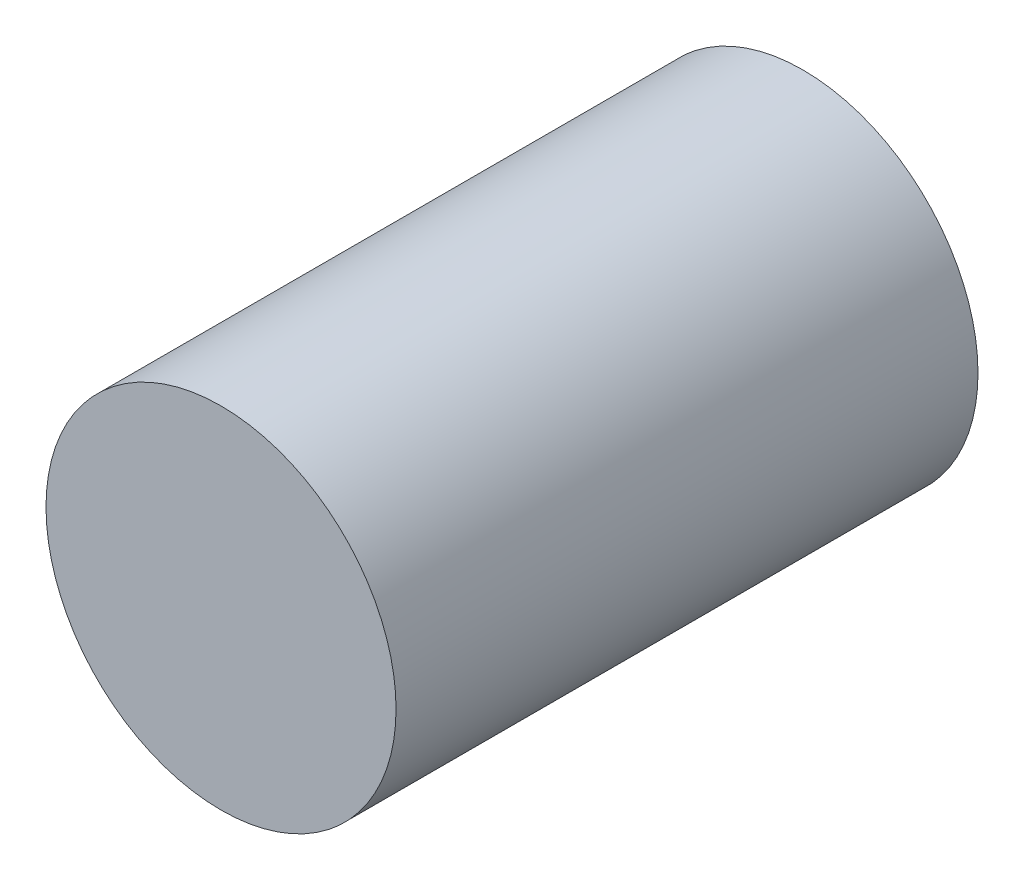
ISO-10303-21;
HEADER;
FILE_DESCRIPTION(('STEP AP214'),'2;1');
FILE_NAME('part.step','',(''),(''),'','','');
FILE_SCHEMA(('AUTOMOTIVE_DESIGN { 1 0 10303 214 1 1 1 1 }'));
ENDSEC;
DATA;
#1=APPLICATION_CONTEXT('core data for automotive mechanical design processes');
#2=APPLICATION_PROTOCOL_DEFINITION('international standard','automotive_design',2000,#1);
#3=PRODUCT_CONTEXT('',#1,'mechanical');
#4=PRODUCT('Part','Part','',(#3));
#5=PRODUCT_RELATED_PRODUCT_CATEGORY('part','',(#4));
#6=PRODUCT_DEFINITION_FORMATION('','',#4);
#7=PRODUCT_DEFINITION_CONTEXT('part definition',#1,'design');
#8=PRODUCT_DEFINITION('design','',#6,#7);
#9=PRODUCT_DEFINITION_SHAPE('','',#8);
#10=(LENGTH_UNIT() NAMED_UNIT(*) SI_UNIT(.MILLI.,.METRE.));
#11=(NAMED_UNIT(*) PLANE_ANGLE_UNIT() SI_UNIT($,.RADIAN.));
#12=(NAMED_UNIT(*) SI_UNIT($,.STERADIAN.) SOLID_ANGLE_UNIT());
#13=UNCERTAINTY_MEASURE_WITH_UNIT(LENGTH_MEASURE(1.E-05),#10,'distance_accuracy_value','');
#14=(GEOMETRIC_REPRESENTATION_CONTEXT(3) GLOBAL_UNCERTAINTY_ASSIGNED_CONTEXT((#13)) GLOBAL_UNIT_ASSIGNED_CONTEXT((#10,
#11,#12)) REPRESENTATION_CONTEXT('',''));
#15=CARTESIAN_POINT('',(0.,0.,0.));
#16=DIRECTION('',(0.,0.,1.));
#17=DIRECTION('',(1.,0.,0.));
#18=AXIS2_PLACEMENT_3D('',#15,#16,#17);
#19=CARTESIAN_POINT('',(0.,0.,10.));
#20=DIRECTION('',(0.,0.,-1.));
#21=DIRECTION('',(-1.,0.,0.));
#22=AXIS2_PLACEMENT_3D('',#19,#20,#21);
#23=CYLINDRICAL_SURFACE('',#22,6.01499999999788);
#24=CARTESIAN_POINT('',(0.,0.,10.));
#25=DIRECTION('',(0.,0.,1.));
#26=DIRECTION('',(1.,0.,0.));
#27=AXIS2_PLACEMENT_3D('',#24,#25,#26);
#28=CIRCLE('',#27,6.01499999999788);
#29=CARTESIAN_POINT('',(6.01499999999788,0.,10.));
#30=VERTEX_POINT('',#29);
#31=EDGE_CURVE('E10',#30,#30,#28,.T.);
#32=ORIENTED_EDGE('',*,*,#31,.F.);
#33=EDGE_LOOP('',(#32));
#34=FACE_BOUND('',#33,.T.);
#35=CARTESIAN_POINT('',(0.,0.,-10.));
#36=DIRECTION('',(0.,0.,1.));
#37=DIRECTION('',(1.,0.,0.));
#38=AXIS2_PLACEMENT_3D('',#35,#36,#37);
#39=CIRCLE('',#38,6.01499999999788);
#40=CARTESIAN_POINT('',(6.01499999999788,0.,-10.));
#41=VERTEX_POINT('',#40);
#42=EDGE_CURVE('E45',#41,#41,#39,.T.);
#43=ORIENTED_EDGE('',*,*,#42,.T.);
#44=EDGE_LOOP('',(#43));
#45=FACE_BOUND('',#44,.T.);
#46=ADVANCED_FACE('F39',(#34,#45),#23,.T.);
#47=CARTESIAN_POINT('',(0.,0.,10.));
#48=DIRECTION('',(0.,0.,1.));
#49=DIRECTION('',(1.,0.,0.));
#50=AXIS2_PLACEMENT_3D('',#47,#48,#49);
#51=PLANE('',#50);
#52=ORIENTED_EDGE('',*,*,#31,.T.);
#53=EDGE_LOOP('',(#52));
#54=FACE_BOUND('',#53,.T.);
#55=ADVANCED_FACE('F53',(#54),#51,.T.);
#56=CARTESIAN_POINT('',(0.,0.,-10.));
#57=DIRECTION('',(0.,0.,1.));
#58=DIRECTION('',(1.,0.,0.));
#59=AXIS2_PLACEMENT_3D('',#56,#57,#58);
#60=PLANE('',#59);
#61=ORIENTED_EDGE('',*,*,#42,.F.);
#62=EDGE_LOOP('',(#61));
#63=FACE_BOUND('',#62,.T.);
#64=ADVANCED_FACE('F55',(#63),#60,.F.);
#65=CLOSED_SHELL('',(#46,#55,#64));
#66=MANIFOLD_SOLID_BREP('B2',#65);
#67=ADVANCED_BREP_SHAPE_REPRESENTATION('',(#18,#66),#14);
#68=SHAPE_DEFINITION_REPRESENTATION(#9,#67);
ENDSEC;
END-ISO-10303-21;
